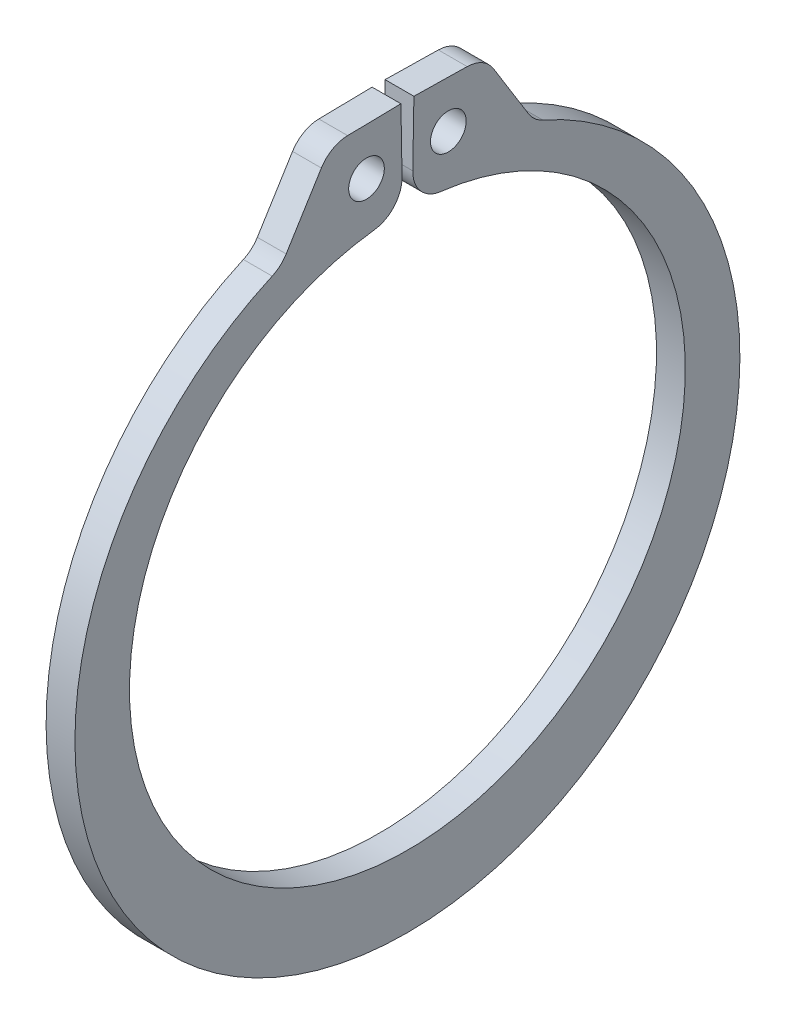
ISO-10303-21;
HEADER;
FILE_DESCRIPTION(('STEP AP214'),'2;1');
FILE_NAME('part.step','',(''),(''),'','','');
FILE_SCHEMA(('AUTOMOTIVE_DESIGN { 1 0 10303 214 1 1 1 1 }'));
ENDSEC;
DATA;
#1=APPLICATION_CONTEXT('core data for automotive mechanical design processes');
#2=APPLICATION_PROTOCOL_DEFINITION('international standard','automotive_design',2000,#1);
#3=PRODUCT_CONTEXT('',#1,'mechanical');
#4=PRODUCT('Part','Part','',(#3));
#5=PRODUCT_RELATED_PRODUCT_CATEGORY('part','',(#4));
#6=PRODUCT_DEFINITION_FORMATION('','',#4);
#7=PRODUCT_DEFINITION_CONTEXT('part definition',#1,'design');
#8=PRODUCT_DEFINITION('design','',#6,#7);
#9=PRODUCT_DEFINITION_SHAPE('','',#8);
#10=(LENGTH_UNIT() NAMED_UNIT(*) SI_UNIT(.MILLI.,.METRE.));
#11=(NAMED_UNIT(*) PLANE_ANGLE_UNIT() SI_UNIT($,.RADIAN.));
#12=(NAMED_UNIT(*) SI_UNIT($,.STERADIAN.) SOLID_ANGLE_UNIT());
#13=UNCERTAINTY_MEASURE_WITH_UNIT(LENGTH_MEASURE(1.E-05),#10,'distance_accuracy_value','');
#14=(GEOMETRIC_REPRESENTATION_CONTEXT(3) GLOBAL_UNCERTAINTY_ASSIGNED_CONTEXT((#13)) GLOBAL_UNIT_ASSIGNED_CONTEXT((#10,
#11,#12)) REPRESENTATION_CONTEXT('',''));
#15=CARTESIAN_POINT('',(0.,0.,0.));
#16=DIRECTION('',(0.,0.,1.));
#17=DIRECTION('',(1.,0.,0.));
#18=AXIS2_PLACEMENT_3D('',#15,#16,#17);
#19=CARTESIAN_POINT('',(0.5334,-0.621449035876225,0.));
#20=DIRECTION('',(1.,0.,0.));
#21=DIRECTION('',(0.,0.,-1.));
#22=AXIS2_PLACEMENT_3D('',#19,#20,#21);
#23=PLANE('',#22);
#24=CARTESIAN_POINT('',(0.5334,12.0022941634062,1.51462460058252));
#25=DIRECTION('',(1.,0.,0.));
#26=DIRECTION('',(0.,0.,-1.));
#27=AXIS2_PLACEMENT_3D('',#24,#25,#26);
#28=CIRCLE('',#27,0.6604);
#29=CARTESIAN_POINT('',(0.5334,12.0022941634062,0.85422460058252));
#30=VERTEX_POINT('',#29);
#31=EDGE_CURVE('E176',#30,#30,#28,.T.);
#32=ORIENTED_EDGE('',*,*,#31,.F.);
#33=EDGE_LOOP('',(#32));
#34=FACE_BOUND('',#33,.T.);
#35=DIRECTION('',(0.,0.850230122964068,0.526411187195433));
#36=VECTOR('',#35,1.);
#37=CARTESIAN_POINT('',(0.5334,13.7191550867387,-2.8497162961447));
#38=LINE('',#37,#36);
#39=CARTESIAN_POINT('',(0.5334,11.0741234414696,-4.48736028328253));
#40=VERTEX_POINT('',#39);
#41=CARTESIAN_POINT('',(0.5334,13.1771180937849,-3.1853128943573));
#42=VERTEX_POINT('',#41);
#43=EDGE_CURVE('E182',#40,#42,#38,.T.);
#44=ORIENTED_EDGE('',*,*,#43,.T.);
#45=CARTESIAN_POINT('',(0.5334,12.5620592626658,-2.19190401868608));
#46=DIRECTION('',(1.,0.,0.));
#47=DIRECTION('',(0.,0.,-1.));
#48=AXIS2_PLACEMENT_3D('',#45,#46,#47);
#49=CIRCLE('',#48,1.1684);
#50=CARTESIAN_POINT('',(0.5334,13.7302813096865,-2.2122954103674));
#51=VERTEX_POINT('',#50);
#52=EDGE_CURVE('E221',#42,#51,#49,.T.);
#53=ORIENTED_EDGE('',*,*,#52,.T.);
#54=DIRECTION('',(0.,0.017452406437283,0.999847695156391));
#55=VECTOR('',#54,1.);
#56=CARTESIAN_POINT('',(0.5334,13.764703249679,-0.240263788940794));
#57=LINE('',#56,#55);
#58=CARTESIAN_POINT('',(0.5334,13.764703249679,-0.240263788940794));
#59=VERTEX_POINT('',#58);
#60=EDGE_CURVE('E185',#51,#59,#57,.T.);
#61=ORIENTED_EDGE('',*,*,#60,.T.);
#62=DIRECTION('',(0.,-0.999847695156391,0.0174524064372839));
#63=VECTOR('',#62,1.);
#64=CARTESIAN_POINT('',(0.5334,10.2854332400738,-0.179532905020334));
#65=LINE('',#64,#63);
#66=CARTESIAN_POINT('',(0.5334,11.3939227961419,-0.198881662193755));
#67=VERTEX_POINT('',#66);
#68=EDGE_CURVE('E153',#59,#67,#65,.T.);
#69=ORIENTED_EDGE('',*,*,#68,.T.);
#70=CARTESIAN_POINT('',(0.5334,11.3735314044606,-1.36710370921448));
#71=DIRECTION('',(1.,0.,0.));
#72=DIRECTION('',(0.,0.,-1.));
#73=AXIS2_PLACEMENT_3D('',#70,#71,#72);
#74=CIRCLE('',#73,1.1684);
#75=CARTESIAN_POINT('',(0.5334,10.213481638152,-1.22766519341877));
#76=VERTEX_POINT('',#75);
#77=EDGE_CURVE('E219',#67,#76,#74,.T.);
#78=ORIENTED_EDGE('',*,*,#77,.T.);
#79=CARTESIAN_POINT('',(0.5334,0.,0.));
#80=DIRECTION('',(-1.,0.,0.));
#81=DIRECTION('',(0.,0.,-1.));
#82=AXIS2_PLACEMENT_3D('',#79,#80,#81);
#83=CIRCLE('',#82,10.287);
#84=CARTESIAN_POINT('',(0.5334,10.213481638152,1.22766519341877));
#85=VERTEX_POINT('',#84);
#86=EDGE_CURVE('E188',#76,#85,#83,.T.);
#87=ORIENTED_EDGE('',*,*,#86,.T.);
#88=CARTESIAN_POINT('',(0.5334,11.3735314044606,1.36710370921448));
#89=DIRECTION('',(1.,0.,0.));
#90=DIRECTION('',(0.,0.,-1.));
#91=AXIS2_PLACEMENT_3D('',#88,#89,#90);
#92=CIRCLE('',#91,1.1684);
#93=CARTESIAN_POINT('',(0.5334,11.3939227961419,0.198881662193756));
#94=VERTEX_POINT('',#93);
#95=EDGE_CURVE('E217',#85,#94,#92,.T.);
#96=ORIENTED_EDGE('',*,*,#95,.T.);
#97=DIRECTION('',(0.,0.999847695156391,0.0174524064372836));
#98=VECTOR('',#97,1.);
#99=CARTESIAN_POINT('',(0.5334,10.2854332400738,0.179532905020335));
#100=LINE('',#99,#98);
#101=CARTESIAN_POINT('',(0.5334,13.764703249679,0.240263788940794));
#102=VERTEX_POINT('',#101);
#103=EDGE_CURVE('E191',#94,#102,#100,.T.);
#104=ORIENTED_EDGE('',*,*,#103,.T.);
#105=DIRECTION('',(0.,-0.017452406437283,0.999847695156391));
#106=VECTOR('',#105,1.);
#107=CARTESIAN_POINT('',(0.5334,13.764703249679,0.240263788940794));
#108=LINE('',#107,#106);
#109=CARTESIAN_POINT('',(0.5334,13.7302813096865,2.2122954103674));
#110=VERTEX_POINT('',#109);
#111=EDGE_CURVE('E193',#102,#110,#108,.T.);
#112=ORIENTED_EDGE('',*,*,#111,.T.);
#113=CARTESIAN_POINT('',(0.5334,12.5620592626658,2.19190401868608));
#114=DIRECTION('',(1.,0.,0.));
#115=DIRECTION('',(0.,0.,-1.));
#116=AXIS2_PLACEMENT_3D('',#113,#114,#115);
#117=CIRCLE('',#116,1.1684);
#118=CARTESIAN_POINT('',(0.5334,13.1771180937849,3.1853128943573));
#119=VERTEX_POINT('',#118);
#120=EDGE_CURVE('E54',#110,#119,#117,.T.);
#121=ORIENTED_EDGE('',*,*,#120,.T.);
#122=DIRECTION('',(0.,-0.850230122964068,0.526411187195433));
#123=VECTOR('',#122,1.);
#124=CARTESIAN_POINT('',(0.5334,13.7191550867387,2.8497162961447));
#125=LINE('',#124,#123);
#126=CARTESIAN_POINT('',(0.5334,11.0741234414696,4.48736028328253));
#127=VERTEX_POINT('',#126);
#128=EDGE_CURVE('E195',#119,#127,#125,.T.);
#129=ORIENTED_EDGE('',*,*,#128,.T.);
#130=CARTESIAN_POINT('',(0.5334,11.6891822725888,5.48076915895375));
#131=DIRECTION('',(1.,0.,0.));
#132=DIRECTION('',(0.,0.,-1.));
#133=AXIS2_PLACEMENT_3D('',#130,#131,#132);
#134=CIRCLE('',#133,1.1684);
#135=CARTESIAN_POINT('',(0.5334,10.6217868347989,5.00555811174905));
#136=VERTEX_POINT('',#135);
#137=EDGE_CURVE('E11',#127,#136,#134,.F.);
#138=ORIENTED_EDGE('',*,*,#137,.T.);
#139=CARTESIAN_POINT('',(0.5334,-0.621449035876225,0.));
#140=DIRECTION('',(1.,0.,0.));
#141=DIRECTION('',(0.,0.,-1.));
#142=AXIS2_PLACEMENT_3D('',#139,#140,#141);
#143=CIRCLE('',#142,12.3071509641238);
#144=CARTESIAN_POINT('',(0.5334,10.6217868347989,-5.00555811174905));
#145=VERTEX_POINT('',#144);
#146=EDGE_CURVE('E179',#136,#145,#143,.T.);
#147=ORIENTED_EDGE('',*,*,#146,.T.);
#148=CARTESIAN_POINT('',(0.5334,11.6891822725888,-5.48076915895375));
#149=DIRECTION('',(1.,0.,0.));
#150=DIRECTION('',(0.,0.,-1.));
#151=AXIS2_PLACEMENT_3D('',#148,#149,#150);
#152=CIRCLE('',#151,1.1684);
#153=EDGE_CURVE('E241',#145,#40,#152,.F.);
#154=ORIENTED_EDGE('',*,*,#153,.T.);
#155=EDGE_LOOP('',(#44,#53,#61,#69,#78,#87,#96,#104,#112,#121,#129,#138,#147,#154));
#156=FACE_BOUND('',#155,.T.);
#157=CARTESIAN_POINT('',(0.5334,12.0022941634062,-1.51462460058252));
#158=DIRECTION('',(1.,0.,0.));
#159=DIRECTION('',(0.,0.,-1.));
#160=AXIS2_PLACEMENT_3D('',#157,#158,#159);
#161=CIRCLE('',#160,0.6604);
#162=CARTESIAN_POINT('',(0.5334,12.0022941634062,-2.17502460058252));
#163=VERTEX_POINT('',#162);
#164=EDGE_CURVE('E173',#163,#163,#161,.T.);
#165=ORIENTED_EDGE('',*,*,#164,.F.);
#166=EDGE_LOOP('',(#165));
#167=FACE_BOUND('',#166,.T.);
#168=ADVANCED_FACE('F32',(#34,#156,#167),#23,.T.);
#169=CARTESIAN_POINT('',(0.5334,-0.621449035876225,0.));
#170=DIRECTION('',(-1.,0.,0.));
#171=DIRECTION('',(0.,0.,1.));
#172=AXIS2_PLACEMENT_3D('',#169,#170,#171);
#173=CYLINDRICAL_SURFACE('',#172,12.3071509641238);
#174=CARTESIAN_POINT('',(-0.5334,-0.621449035876225,0.));
#175=DIRECTION('',(1.,0.,0.));
#176=DIRECTION('',(0.,0.,-1.));
#177=AXIS2_PLACEMENT_3D('',#174,#175,#176);
#178=CIRCLE('',#177,12.3071509641238);
#179=CARTESIAN_POINT('',(-0.5334,10.6217868347989,5.00555811174905));
#180=VERTEX_POINT('',#179);
#181=CARTESIAN_POINT('',(-0.5334,10.6217868347989,-5.00555811174905));
#182=VERTEX_POINT('',#181);
#183=EDGE_CURVE('E245',#180,#182,#178,.T.);
#184=ORIENTED_EDGE('',*,*,#183,.T.);
#185=DIRECTION('',(-1.,0.,0.));
#186=VECTOR('',#185,1.);
#187=CARTESIAN_POINT('',(0.5334,10.6217868347989,-5.00555811174905));
#188=LINE('',#187,#186);
#189=EDGE_CURVE('E206',#182,#145,#188,.F.);
#190=ORIENTED_EDGE('',*,*,#189,.T.);
#191=ORIENTED_EDGE('',*,*,#146,.F.);
#192=DIRECTION('',(-1.,0.,0.));
#193=VECTOR('',#192,1.);
#194=CARTESIAN_POINT('',(0.5334,10.6217868347989,5.00555811174905));
#195=LINE('',#194,#193);
#196=EDGE_CURVE('E203',#136,#180,#195,.T.);
#197=ORIENTED_EDGE('',*,*,#196,.T.);
#198=EDGE_LOOP('',(#184,#190,#191,#197));
#199=FACE_BOUND('',#198,.T.);
#200=ADVANCED_FACE('F255',(#199),#173,.T.);
#201=CARTESIAN_POINT('',(0.5334,13.7191550867387,-2.8497162961447));
#202=DIRECTION('',(0.,-0.526411187195433,0.850230122964068));
#203=DIRECTION('',(0.,-0.850230122964068,-0.526411187195433));
#204=AXIS2_PLACEMENT_3D('',#201,#202,#203);
#205=PLANE('',#204);
#206=ORIENTED_EDGE('',*,*,#43,.F.);
#207=DIRECTION('',(1.,0.,0.));
#208=VECTOR('',#207,1.);
#209=CARTESIAN_POINT('',(-0.5334,11.0741234414696,-4.48736028328253));
#210=LINE('',#209,#208);
#211=CARTESIAN_POINT('',(-0.5334,11.0741234414696,-4.48736028328253));
#212=VERTEX_POINT('',#211);
#213=EDGE_CURVE('E200',#40,#212,#210,.F.);
#214=ORIENTED_EDGE('',*,*,#213,.T.);
#215=DIRECTION('',(0.,0.850230122964068,0.526411187195433));
#216=VECTOR('',#215,1.);
#217=CARTESIAN_POINT('',(-0.5334,13.7191550867387,-2.8497162961447));
#218=LINE('',#217,#216);
#219=CARTESIAN_POINT('',(-0.5334,13.1771180937849,-3.1853128943573));
#220=VERTEX_POINT('',#219);
#221=EDGE_CURVE('E146',#212,#220,#218,.T.);
#222=ORIENTED_EDGE('',*,*,#221,.T.);
#223=DIRECTION('',(-1.,0.,0.));
#224=VECTOR('',#223,1.);
#225=CARTESIAN_POINT('',(0.5334,13.1771180937849,-3.1853128943573));
#226=LINE('',#225,#224);
#227=EDGE_CURVE('E154',#220,#42,#226,.F.);
#228=ORIENTED_EDGE('',*,*,#227,.T.);
#229=EDGE_LOOP('',(#206,#214,#222,#228));
#230=FACE_BOUND('',#229,.T.);
#231=ADVANCED_FACE('F263',(#230),#205,.F.);
#232=CARTESIAN_POINT('',(0.5334,13.764703249679,-0.240263788940794));
#233=DIRECTION('',(0.,-0.999847695156391,0.017452406437283));
#234=DIRECTION('',(0.,-0.017452406437283,-0.999847695156391));
#235=AXIS2_PLACEMENT_3D('',#232,#233,#234);
#236=PLANE('',#235);
#237=ORIENTED_EDGE('',*,*,#60,.F.);
#238=DIRECTION('',(-1.,0.,0.));
#239=VECTOR('',#238,1.);
#240=CARTESIAN_POINT('',(0.5334,13.7302813096865,-2.2122954103674));
#241=LINE('',#240,#239);
#242=CARTESIAN_POINT('',(-0.5334,13.7302813096865,-2.2122954103674));
#243=VERTEX_POINT('',#242);
#244=EDGE_CURVE('E142',#51,#243,#241,.T.);
#245=ORIENTED_EDGE('',*,*,#244,.T.);
#246=DIRECTION('',(0.,0.017452406437283,0.999847695156391));
#247=VECTOR('',#246,1.);
#248=CARTESIAN_POINT('',(-0.5334,13.764703249679,-0.240263788940794));
#249=LINE('',#248,#247);
#250=CARTESIAN_POINT('',(-0.5334,13.764703249679,-0.240263788940794));
#251=VERTEX_POINT('',#250);
#252=EDGE_CURVE('E135',#243,#251,#249,.T.);
#253=ORIENTED_EDGE('',*,*,#252,.T.);
#254=DIRECTION('',(-1.,0.,0.));
#255=VECTOR('',#254,1.);
#256=CARTESIAN_POINT('',(0.5334,13.764703249679,-0.240263788940794));
#257=LINE('',#256,#255);
#258=EDGE_CURVE('E139',#59,#251,#257,.T.);
#259=ORIENTED_EDGE('',*,*,#258,.F.);
#260=EDGE_LOOP('',(#237,#245,#253,#259));
#261=FACE_BOUND('',#260,.T.);
#262=ADVANCED_FACE('F138',(#261),#236,.F.);
#263=CARTESIAN_POINT('',(0.5334,10.2854332400738,-0.179532905020334));
#264=DIRECTION('',(0.,-0.0174524064372839,-0.999847695156391));
#265=DIRECTION('',(0.,0.999847695156391,-0.0174524064372839));
#266=AXIS2_PLACEMENT_3D('',#263,#264,#265);
#267=PLANE('',#266);
#268=DIRECTION('',(0.,-0.999847695156391,0.0174524064372839));
#269=VECTOR('',#268,1.);
#270=CARTESIAN_POINT('',(-0.5334,10.2854332400738,-0.179532905020334));
#271=LINE('',#270,#269);
#272=CARTESIAN_POINT('',(-0.5334,11.3939227961419,-0.198881662193755));
#273=VERTEX_POINT('',#272);
#274=EDGE_CURVE('E145',#251,#273,#271,.T.);
#275=ORIENTED_EDGE('',*,*,#274,.T.);
#276=DIRECTION('',(-1.,0.,0.));
#277=VECTOR('',#276,1.);
#278=CARTESIAN_POINT('',(0.5334,11.3939227961419,-0.198881662193755));
#279=LINE('',#278,#277);
#280=EDGE_CURVE('E228',#273,#67,#279,.F.);
#281=ORIENTED_EDGE('',*,*,#280,.T.);
#282=ORIENTED_EDGE('',*,*,#68,.F.);
#283=ORIENTED_EDGE('',*,*,#258,.T.);
#284=EDGE_LOOP('',(#275,#281,#282,#283));
#285=FACE_BOUND('',#284,.T.);
#286=ADVANCED_FACE('F150',(#285),#267,.F.);
#287=CARTESIAN_POINT('',(0.5334,0.,0.));
#288=DIRECTION('',(-1.,0.,0.));
#289=DIRECTION('',(0.,0.,1.));
#290=AXIS2_PLACEMENT_3D('',#287,#288,#289);
#291=CYLINDRICAL_SURFACE('',#290,10.287);
#292=ORIENTED_EDGE('',*,*,#86,.F.);
#293=DIRECTION('',(-1.,0.,0.));
#294=VECTOR('',#293,1.);
#295=CARTESIAN_POINT('',(0.5334,10.213481638152,-1.22766519341877));
#296=LINE('',#295,#294);
#297=CARTESIAN_POINT('',(-0.5334,10.213481638152,-1.22766519341877));
#298=VERTEX_POINT('',#297);
#299=EDGE_CURVE('E225',#76,#298,#296,.T.);
#300=ORIENTED_EDGE('',*,*,#299,.T.);
#301=CARTESIAN_POINT('',(-0.5334,0.,0.));
#302=DIRECTION('',(-1.,0.,0.));
#303=DIRECTION('',(0.,0.,-1.));
#304=AXIS2_PLACEMENT_3D('',#301,#302,#303);
#305=CIRCLE('',#304,10.287);
#306=CARTESIAN_POINT('',(-0.5334,10.213481638152,1.22766519341877));
#307=VERTEX_POINT('',#306);
#308=EDGE_CURVE('E160',#298,#307,#305,.T.);
#309=ORIENTED_EDGE('',*,*,#308,.T.);
#310=DIRECTION('',(-1.,0.,0.));
#311=VECTOR('',#310,1.);
#312=CARTESIAN_POINT('',(0.5334,10.213481638152,1.22766519341877));
#313=LINE('',#312,#311);
#314=EDGE_CURVE('E223',#307,#85,#313,.F.);
#315=ORIENTED_EDGE('',*,*,#314,.T.);
#316=EDGE_LOOP('',(#292,#300,#309,#315));
#317=FACE_BOUND('',#316,.T.);
#318=ADVANCED_FACE('F275',(#317),#291,.F.);
#319=CARTESIAN_POINT('',(0.5334,10.2854332400738,0.179532905020335));
#320=DIRECTION('',(0.,-0.0174524064372836,0.999847695156391));
#321=DIRECTION('',(0.,-0.999847695156391,-0.0174524064372836));
#322=AXIS2_PLACEMENT_3D('',#319,#320,#321);
#323=PLANE('',#322);
#324=ORIENTED_EDGE('',*,*,#103,.F.);
#325=DIRECTION('',(-1.,0.,0.));
#326=VECTOR('',#325,1.);
#327=CARTESIAN_POINT('',(0.5334,11.3939227961419,0.198881662193756));
#328=LINE('',#327,#326);
#329=CARTESIAN_POINT('',(-0.5334,11.3939227961419,0.198881662193756));
#330=VERTEX_POINT('',#329);
#331=EDGE_CURVE('E230',#94,#330,#328,.T.);
#332=ORIENTED_EDGE('',*,*,#331,.T.);
#333=DIRECTION('',(0.,0.999847695156391,0.0174524064372836));
#334=VECTOR('',#333,1.);
#335=CARTESIAN_POINT('',(-0.5334,10.2854332400738,0.179532905020335));
#336=LINE('',#335,#334);
#337=CARTESIAN_POINT('',(-0.5334,13.764703249679,0.240263788940794));
#338=VERTEX_POINT('',#337);
#339=EDGE_CURVE('E163',#330,#338,#336,.T.);
#340=ORIENTED_EDGE('',*,*,#339,.T.);
#341=DIRECTION('',(-1.,0.,0.));
#342=VECTOR('',#341,1.);
#343=CARTESIAN_POINT('',(0.5334,13.764703249679,0.240263788940794));
#344=LINE('',#343,#342);
#345=EDGE_CURVE('E155',#102,#338,#344,.T.);
#346=ORIENTED_EDGE('',*,*,#345,.F.);
#347=EDGE_LOOP('',(#324,#332,#340,#346));
#348=FACE_BOUND('',#347,.T.);
#349=ADVANCED_FACE('F285',(#348),#323,.F.);
#350=CARTESIAN_POINT('',(0.5334,13.764703249679,0.240263788940794));
#351=DIRECTION('',(0.,-0.999847695156391,-0.017452406437283));
#352=DIRECTION('',(0.,0.017452406437283,-0.999847695156391));
#353=AXIS2_PLACEMENT_3D('',#350,#351,#352);
#354=PLANE('',#353);
#355=DIRECTION('',(0.,-0.017452406437283,0.999847695156391));
#356=VECTOR('',#355,1.);
#357=CARTESIAN_POINT('',(-0.5334,13.764703249679,0.240263788940794));
#358=LINE('',#357,#356);
#359=CARTESIAN_POINT('',(-0.5334,13.7302813096865,2.2122954103674));
#360=VERTEX_POINT('',#359);
#361=EDGE_CURVE('E168',#338,#360,#358,.T.);
#362=ORIENTED_EDGE('',*,*,#361,.T.);
#363=DIRECTION('',(-1.,0.,0.));
#364=VECTOR('',#363,1.);
#365=CARTESIAN_POINT('',(0.5334,13.7302813096865,2.2122954103674));
#366=LINE('',#365,#364);
#367=EDGE_CURVE('E237',#360,#110,#366,.F.);
#368=ORIENTED_EDGE('',*,*,#367,.T.);
#369=ORIENTED_EDGE('',*,*,#111,.F.);
#370=ORIENTED_EDGE('',*,*,#345,.T.);
#371=EDGE_LOOP('',(#362,#368,#369,#370));
#372=FACE_BOUND('',#371,.T.);
#373=ADVANCED_FACE('F292',(#372),#354,.F.);
#374=CARTESIAN_POINT('',(0.5334,13.7191550867387,2.8497162961447));
#375=DIRECTION('',(0.,-0.526411187195433,-0.850230122964068));
#376=DIRECTION('',(0.,0.850230122964068,-0.526411187195433));
#377=AXIS2_PLACEMENT_3D('',#374,#375,#376);
#378=PLANE('',#377);
#379=ORIENTED_EDGE('',*,*,#128,.F.);
#380=DIRECTION('',(-1.,0.,0.));
#381=VECTOR('',#380,1.);
#382=CARTESIAN_POINT('',(0.5334,13.1771180937849,3.1853128943573));
#383=LINE('',#382,#381);
#384=CARTESIAN_POINT('',(-0.5334,13.1771180937849,3.1853128943573));
#385=VERTEX_POINT('',#384);
#386=EDGE_CURVE('E234',#119,#385,#383,.T.);
#387=ORIENTED_EDGE('',*,*,#386,.T.);
#388=DIRECTION('',(0.,-0.850230122964068,0.526411187195433));
#389=VECTOR('',#388,1.);
#390=CARTESIAN_POINT('',(-0.5334,13.7191550867387,2.8497162961447));
#391=LINE('',#390,#389);
#392=CARTESIAN_POINT('',(-0.5334,11.0741234414696,4.48736028328253));
#393=VERTEX_POINT('',#392);
#394=EDGE_CURVE('E171',#385,#393,#391,.T.);
#395=ORIENTED_EDGE('',*,*,#394,.T.);
#396=DIRECTION('',(1.,0.,0.));
#397=VECTOR('',#396,1.);
#398=CARTESIAN_POINT('',(0.5334,11.0741234414696,4.48736028328253));
#399=LINE('',#398,#397);
#400=EDGE_CURVE('E47',#393,#127,#399,.T.);
#401=ORIENTED_EDGE('',*,*,#400,.T.);
#402=EDGE_LOOP('',(#379,#387,#395,#401));
#403=FACE_BOUND('',#402,.T.);
#404=ADVANCED_FACE('F248',(#403),#378,.F.);
#405=CARTESIAN_POINT('',(0.5334,12.0022941634062,1.51462460058252));
#406=DIRECTION('',(-1.,0.,0.));
#407=DIRECTION('',(0.,0.,1.));
#408=AXIS2_PLACEMENT_3D('',#405,#406,#407);
#409=CYLINDRICAL_SURFACE('',#408,0.6604);
#410=ORIENTED_EDGE('',*,*,#31,.T.);
#411=EDGE_LOOP('',(#410));
#412=FACE_BOUND('',#411,.T.);
#413=CARTESIAN_POINT('',(-0.5334,12.0022941634062,1.51462460058252));
#414=DIRECTION('',(1.,0.,0.));
#415=DIRECTION('',(0.,0.,-1.));
#416=AXIS2_PLACEMENT_3D('',#413,#414,#415);
#417=CIRCLE('',#416,0.6604);
#418=CARTESIAN_POINT('',(-0.5334,12.0022941634062,0.85422460058252));
#419=VERTEX_POINT('',#418);
#420=EDGE_CURVE('E330',#419,#419,#417,.T.);
#421=ORIENTED_EDGE('',*,*,#420,.F.);
#422=EDGE_LOOP('',(#421));
#423=FACE_BOUND('',#422,.T.);
#424=ADVANCED_FACE('F299',(#412,#423),#409,.F.);
#425=CARTESIAN_POINT('',(0.5334,12.0022941634062,-1.51462460058252));
#426=DIRECTION('',(-1.,0.,0.));
#427=DIRECTION('',(0.,0.,1.));
#428=AXIS2_PLACEMENT_3D('',#425,#426,#427);
#429=CYLINDRICAL_SURFACE('',#428,0.6604);
#430=ORIENTED_EDGE('',*,*,#164,.T.);
#431=EDGE_LOOP('',(#430));
#432=FACE_BOUND('',#431,.T.);
#433=CARTESIAN_POINT('',(-0.5334,12.0022941634062,-1.51462460058252));
#434=DIRECTION('',(1.,0.,0.));
#435=DIRECTION('',(0.,0.,-1.));
#436=AXIS2_PLACEMENT_3D('',#433,#434,#435);
#437=CIRCLE('',#436,0.6604);
#438=CARTESIAN_POINT('',(-0.5334,12.0022941634062,-2.17502460058252));
#439=VERTEX_POINT('',#438);
#440=EDGE_CURVE('E327',#439,#439,#437,.T.);
#441=ORIENTED_EDGE('',*,*,#440,.F.);
#442=EDGE_LOOP('',(#441));
#443=FACE_BOUND('',#442,.T.);
#444=ADVANCED_FACE('F313',(#432,#443),#429,.F.);
#445=CARTESIAN_POINT('',(-0.5334,-0.621449035876225,0.));
#446=DIRECTION('',(1.,0.,0.));
#447=DIRECTION('',(0.,0.,-1.));
#448=AXIS2_PLACEMENT_3D('',#445,#446,#447);
#449=PLANE('',#448);
#450=ORIENTED_EDGE('',*,*,#440,.T.);
#451=EDGE_LOOP('',(#450));
#452=FACE_BOUND('',#451,.T.);
#453=ORIENTED_EDGE('',*,*,#420,.T.);
#454=EDGE_LOOP('',(#453));
#455=FACE_BOUND('',#454,.T.);
#456=ORIENTED_EDGE('',*,*,#252,.F.);
#457=CARTESIAN_POINT('',(-0.5334,12.5620592626658,-2.19190401868608));
#458=DIRECTION('',(1.,0.,0.));
#459=DIRECTION('',(0.,0.,-1.));
#460=AXIS2_PLACEMENT_3D('',#457,#458,#459);
#461=CIRCLE('',#460,1.1684);
#462=EDGE_CURVE('E214',#243,#220,#461,.F.);
#463=ORIENTED_EDGE('',*,*,#462,.T.);
#464=ORIENTED_EDGE('',*,*,#221,.F.);
#465=CARTESIAN_POINT('',(-0.5334,11.6891822725888,-5.48076915895375));
#466=DIRECTION('',(1.,0.,0.));
#467=DIRECTION('',(0.,0.,-1.));
#468=AXIS2_PLACEMENT_3D('',#465,#466,#467);
#469=CIRCLE('',#468,1.1684);
#470=EDGE_CURVE('E239',#212,#182,#469,.T.);
#471=ORIENTED_EDGE('',*,*,#470,.T.);
#472=ORIENTED_EDGE('',*,*,#183,.F.);
#473=CARTESIAN_POINT('',(-0.5334,11.6891822725888,5.48076915895375));
#474=DIRECTION('',(1.,0.,0.));
#475=DIRECTION('',(0.,0.,-1.));
#476=AXIS2_PLACEMENT_3D('',#473,#474,#475);
#477=CIRCLE('',#476,1.1684);
#478=EDGE_CURVE('E40',#180,#393,#477,.T.);
#479=ORIENTED_EDGE('',*,*,#478,.T.);
#480=ORIENTED_EDGE('',*,*,#394,.F.);
#481=CARTESIAN_POINT('',(-0.5334,12.5620592626658,2.19190401868608));
#482=DIRECTION('',(1.,0.,0.));
#483=DIRECTION('',(0.,0.,-1.));
#484=AXIS2_PLACEMENT_3D('',#481,#482,#483);
#485=CIRCLE('',#484,1.1684);
#486=EDGE_CURVE('E209',#385,#360,#485,.F.);
#487=ORIENTED_EDGE('',*,*,#486,.T.);
#488=ORIENTED_EDGE('',*,*,#361,.F.);
#489=ORIENTED_EDGE('',*,*,#339,.F.);
#490=CARTESIAN_POINT('',(-0.5334,11.3735314044606,1.36710370921448));
#491=DIRECTION('',(1.,0.,0.));
#492=DIRECTION('',(0.,0.,-1.));
#493=AXIS2_PLACEMENT_3D('',#490,#491,#492);
#494=CIRCLE('',#493,1.1684);
#495=EDGE_CURVE('E211',#330,#307,#494,.F.);
#496=ORIENTED_EDGE('',*,*,#495,.T.);
#497=ORIENTED_EDGE('',*,*,#308,.F.);
#498=CARTESIAN_POINT('',(-0.5334,11.3735314044606,-1.36710370921448));
#499=DIRECTION('',(1.,0.,0.));
#500=DIRECTION('',(0.,0.,-1.));
#501=AXIS2_PLACEMENT_3D('',#498,#499,#500);
#502=CIRCLE('',#501,1.1684);
#503=EDGE_CURVE('E159',#298,#273,#502,.F.);
#504=ORIENTED_EDGE('',*,*,#503,.T.);
#505=ORIENTED_EDGE('',*,*,#274,.F.);
#506=EDGE_LOOP('',(#456,#463,#464,#471,#472,#479,#480,#487,#488,#489,#496,#497,#504,#505));
#507=FACE_BOUND('',#506,.T.);
#508=ADVANCED_FACE('F157',(#452,#455,#507),#449,.F.);
#509=CARTESIAN_POINT('',(0.5334,11.6891822725888,-5.48076915895375));
#510=DIRECTION('',(-1.,0.,0.));
#511=DIRECTION('',(0.,0.,1.));
#512=AXIS2_PLACEMENT_3D('',#509,#510,#511);
#513=CYLINDRICAL_SURFACE('',#512,1.1684);
#514=ORIENTED_EDGE('',*,*,#153,.F.);
#515=ORIENTED_EDGE('',*,*,#189,.F.);
#516=ORIENTED_EDGE('',*,*,#470,.F.);
#517=ORIENTED_EDGE('',*,*,#213,.F.);
#518=EDGE_LOOP('',(#514,#515,#516,#517));
#519=FACE_BOUND('',#518,.T.);
#520=ADVANCED_FACE('F258',(#519),#513,.F.);
#521=CARTESIAN_POINT('',(0.5334,12.5620592626658,-2.19190401868608));
#522=DIRECTION('',(-1.,0.,0.));
#523=DIRECTION('',(0.,0.,1.));
#524=AXIS2_PLACEMENT_3D('',#521,#522,#523);
#525=CYLINDRICAL_SURFACE('',#524,1.1684);
#526=ORIENTED_EDGE('',*,*,#52,.F.);
#527=ORIENTED_EDGE('',*,*,#227,.F.);
#528=ORIENTED_EDGE('',*,*,#462,.F.);
#529=ORIENTED_EDGE('',*,*,#244,.F.);
#530=EDGE_LOOP('',(#526,#527,#528,#529));
#531=FACE_BOUND('',#530,.T.);
#532=ADVANCED_FACE('F268',(#531),#525,.T.);
#533=CARTESIAN_POINT('',(0.5334,11.3735314044606,-1.36710370921448));
#534=DIRECTION('',(-1.,0.,0.));
#535=DIRECTION('',(0.,0.,1.));
#536=AXIS2_PLACEMENT_3D('',#533,#534,#535);
#537=CYLINDRICAL_SURFACE('',#536,1.1684);
#538=ORIENTED_EDGE('',*,*,#77,.F.);
#539=ORIENTED_EDGE('',*,*,#280,.F.);
#540=ORIENTED_EDGE('',*,*,#503,.F.);
#541=ORIENTED_EDGE('',*,*,#299,.F.);
#542=EDGE_LOOP('',(#538,#539,#540,#541));
#543=FACE_BOUND('',#542,.T.);
#544=ADVANCED_FACE('F273',(#543),#537,.T.);
#545=CARTESIAN_POINT('',(0.5334,11.3735314044606,1.36710370921448));
#546=DIRECTION('',(-1.,0.,0.));
#547=DIRECTION('',(0.,0.,1.));
#548=AXIS2_PLACEMENT_3D('',#545,#546,#547);
#549=CYLINDRICAL_SURFACE('',#548,1.1684);
#550=ORIENTED_EDGE('',*,*,#95,.F.);
#551=ORIENTED_EDGE('',*,*,#314,.F.);
#552=ORIENTED_EDGE('',*,*,#495,.F.);
#553=ORIENTED_EDGE('',*,*,#331,.F.);
#554=EDGE_LOOP('',(#550,#551,#552,#553));
#555=FACE_BOUND('',#554,.T.);
#556=ADVANCED_FACE('F282',(#555),#549,.T.);
#557=CARTESIAN_POINT('',(0.5334,12.5620592626658,2.19190401868608));
#558=DIRECTION('',(-1.,0.,0.));
#559=DIRECTION('',(0.,0.,1.));
#560=AXIS2_PLACEMENT_3D('',#557,#558,#559);
#561=CYLINDRICAL_SURFACE('',#560,1.1684);
#562=ORIENTED_EDGE('',*,*,#120,.F.);
#563=ORIENTED_EDGE('',*,*,#367,.F.);
#564=ORIENTED_EDGE('',*,*,#486,.F.);
#565=ORIENTED_EDGE('',*,*,#386,.F.);
#566=EDGE_LOOP('',(#562,#563,#564,#565));
#567=FACE_BOUND('',#566,.T.);
#568=ADVANCED_FACE('F291',(#567),#561,.T.);
#569=CARTESIAN_POINT('',(0.5334,11.6891822725888,5.48076915895375));
#570=DIRECTION('',(-1.,0.,0.));
#571=DIRECTION('',(0.,0.,1.));
#572=AXIS2_PLACEMENT_3D('',#569,#570,#571);
#573=CYLINDRICAL_SURFACE('',#572,1.1684);
#574=ORIENTED_EDGE('',*,*,#137,.F.);
#575=ORIENTED_EDGE('',*,*,#400,.F.);
#576=ORIENTED_EDGE('',*,*,#478,.F.);
#577=ORIENTED_EDGE('',*,*,#196,.F.);
#578=EDGE_LOOP('',(#574,#575,#576,#577));
#579=FACE_BOUND('',#578,.T.);
#580=ADVANCED_FACE('F34',(#579),#573,.F.);
#581=CLOSED_SHELL('',(#168,#200,#231,#262,#286,#318,#349,#373,#404,#424,#444,#508,#520,#532,
#544,#556,#568,#580));
#582=MANIFOLD_SOLID_BREP('B2',#581);
#583=ADVANCED_BREP_SHAPE_REPRESENTATION('',(#18,#582),#14);
#584=SHAPE_DEFINITION_REPRESENTATION(#9,#583);
ENDSEC;
END-ISO-10303-21;
